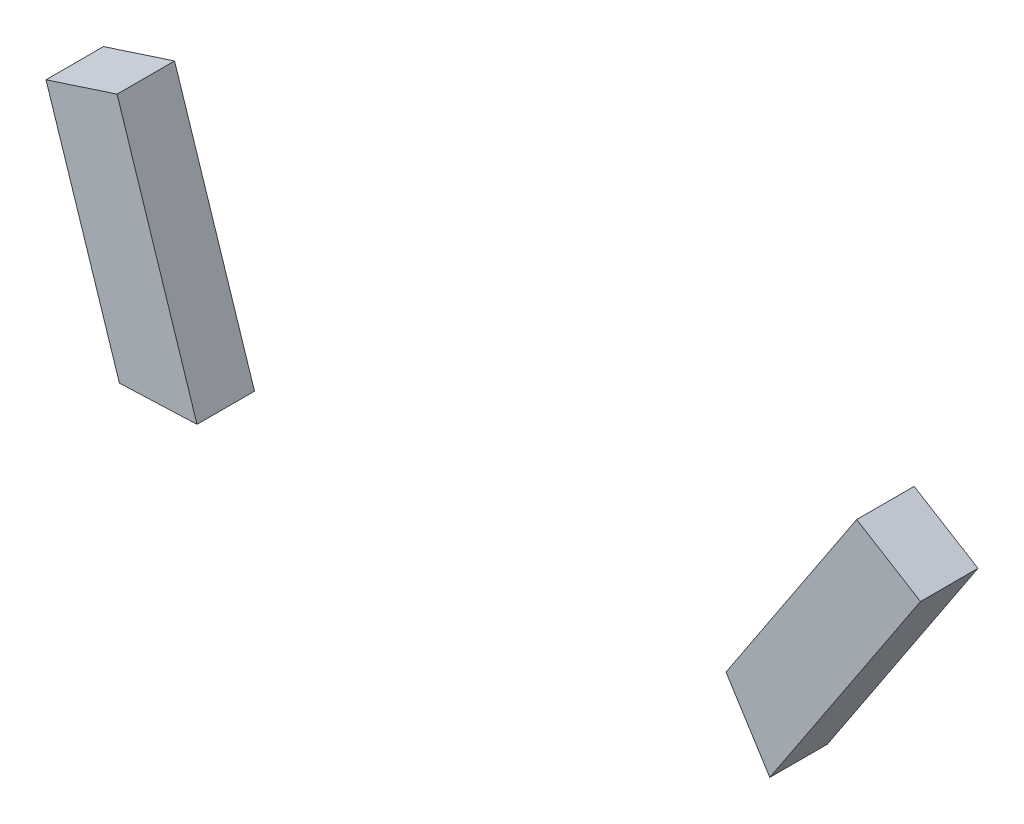
ISO-10303-21;
HEADER;
FILE_DESCRIPTION(('STEP AP214'),'2;1');
FILE_NAME('part.step','',(''),(''),'','','');
FILE_SCHEMA(('AUTOMOTIVE_DESIGN { 1 0 10303 214 1 1 1 1 }'));
ENDSEC;
DATA;
#1=APPLICATION_CONTEXT('core data for automotive mechanical design processes');
#2=APPLICATION_PROTOCOL_DEFINITION('international standard','automotive_design',2000,#1);
#3=PRODUCT_CONTEXT('',#1,'mechanical');
#4=PRODUCT('Part','Part','',(#3));
#5=PRODUCT_RELATED_PRODUCT_CATEGORY('part','',(#4));
#6=PRODUCT_DEFINITION_FORMATION('','',#4);
#7=PRODUCT_DEFINITION_CONTEXT('part definition',#1,'design');
#8=PRODUCT_DEFINITION('design','',#6,#7);
#9=PRODUCT_DEFINITION_SHAPE('','',#8);
#10=(LENGTH_UNIT() NAMED_UNIT(*) SI_UNIT(.MILLI.,.METRE.));
#11=(NAMED_UNIT(*) PLANE_ANGLE_UNIT() SI_UNIT($,.RADIAN.));
#12=(NAMED_UNIT(*) SI_UNIT($,.STERADIAN.) SOLID_ANGLE_UNIT());
#13=UNCERTAINTY_MEASURE_WITH_UNIT(LENGTH_MEASURE(1.E-05),#10,'distance_accuracy_value','');
#14=(GEOMETRIC_REPRESENTATION_CONTEXT(3) GLOBAL_UNCERTAINTY_ASSIGNED_CONTEXT((#13)) GLOBAL_UNIT_ASSIGNED_CONTEXT((#10,
#11,#12)) REPRESENTATION_CONTEXT('',''));
#15=CARTESIAN_POINT('',(0.,0.,0.));
#16=DIRECTION('',(0.,0.,1.));
#17=DIRECTION('',(1.,0.,0.));
#18=AXIS2_PLACEMENT_3D('',#15,#16,#17);
#19=CARTESIAN_POINT('',(-0.79770947286416,-0.259191519605136,0.4));
#20=DIRECTION('',(-0.951056516295153,-0.309016994374949,0.));
#21=DIRECTION('',(0.309016994374949,-0.951056516295153,0.));
#22=AXIS2_PLACEMENT_3D('',#19,#20,#21);
#23=PLANE('',#22);
#24=DIRECTION('',(-0.309016994374949,0.951056516295153,0.));
#25=VECTOR('',#24,1.);
#26=CARTESIAN_POINT('',(-0.79770947286416,-0.259191519605136,0.));
#27=LINE('',#26,#25);
#28=CARTESIAN_POINT('',(-2.01831531648811,3.49744699069618,0.));
#29=VERTEX_POINT('',#28);
#30=CARTESIAN_POINT('',(-2.52923756331339,5.06990397852694,0.));
#31=VERTEX_POINT('',#30);
#32=EDGE_CURVE('E105',#29,#31,#27,.T.);
#33=ORIENTED_EDGE('',*,*,#32,.F.);
#34=DIRECTION('',(0.,0.,-1.));
#35=VECTOR('',#34,1.);
#36=CARTESIAN_POINT('',(-2.01831531648811,3.49744699069618,0.4));
#37=LINE('',#36,#35);
#38=CARTESIAN_POINT('',(-2.01831531648811,3.49744699069618,0.4));
#39=VERTEX_POINT('',#38);
#40=EDGE_CURVE('E12',#39,#29,#37,.T.);
#41=ORIENTED_EDGE('',*,*,#40,.F.);
#42=DIRECTION('',(-0.309016994374949,0.951056516295153,0.));
#43=VECTOR('',#42,1.);
#44=CARTESIAN_POINT('',(-0.79770947286416,-0.259191519605136,0.4));
#45=LINE('',#44,#43);
#46=CARTESIAN_POINT('',(-2.52923756331339,5.06990397852694,0.4));
#47=VERTEX_POINT('',#46);
#48=EDGE_CURVE('E90',#39,#47,#45,.T.);
#49=ORIENTED_EDGE('',*,*,#48,.T.);
#50=DIRECTION('',(0.,0.,-1.));
#51=VECTOR('',#50,1.);
#52=CARTESIAN_POINT('',(-2.52923756331339,5.06990397852694,0.4));
#53=LINE('',#52,#51);
#54=EDGE_CURVE('E58',#47,#31,#53,.T.);
#55=ORIENTED_EDGE('',*,*,#54,.T.);
#56=EDGE_LOOP('',(#33,#41,#49,#55));
#57=FACE_BOUND('',#56,.T.);
#58=ADVANCED_FACE('F42',(#57),#23,.T.);
#59=CARTESIAN_POINT('',(-0.140536818504142,3.57133998796101,0.4));
#60=DIRECTION('',(-0.0393208523677325,0.999226636238784,0.));
#61=DIRECTION('',(-0.999226636238784,-0.0393208523677325,0.));
#62=AXIS2_PLACEMENT_3D('',#59,#60,#61);
#63=PLANE('',#62);
#64=DIRECTION('',(0.999226636238784,0.0393208523677325,0.));
#65=VECTOR('',#64,1.);
#66=CARTESIAN_POINT('',(-0.140536818504142,3.57133998796101,0.));
#67=LINE('',#66,#65);
#68=CARTESIAN_POINT('',(-1.478457584965,3.51869108627064,0.));
#69=VERTEX_POINT('',#68);
#70=EDGE_CURVE('E96',#29,#69,#67,.T.);
#71=ORIENTED_EDGE('',*,*,#70,.T.);
#72=DIRECTION('',(0.,0.,-1.));
#73=VECTOR('',#72,1.);
#74=CARTESIAN_POINT('',(-1.478457584965,3.51869108627064,0.4));
#75=LINE('',#74,#73);
#76=CARTESIAN_POINT('',(-1.478457584965,3.51869108627064,0.4));
#77=VERTEX_POINT('',#76);
#78=EDGE_CURVE('E50',#77,#69,#75,.T.);
#79=ORIENTED_EDGE('',*,*,#78,.F.);
#80=DIRECTION('',(0.999226636238784,0.0393208523677325,0.));
#81=VECTOR('',#80,1.);
#82=CARTESIAN_POINT('',(-0.140536818504142,3.57133998796101,0.4));
#83=LINE('',#82,#81);
#84=EDGE_CURVE('E84',#39,#77,#83,.T.);
#85=ORIENTED_EDGE('',*,*,#84,.F.);
#86=ORIENTED_EDGE('',*,*,#40,.T.);
#87=EDGE_LOOP('',(#71,#79,#85,#86));
#88=FACE_BOUND('',#87,.T.);
#89=ADVANCED_FACE('F94',(#88),#63,.F.);
#90=CARTESIAN_POINT('',(-0.303160084390678,-0.098502682530162,0.4));
#91=DIRECTION('',(0.951056516295153,0.309016994374949,0.));
#92=DIRECTION('',(-0.309016994374949,0.951056516295153,0.));
#93=AXIS2_PLACEMENT_3D('',#90,#91,#92);
#94=PLANE('',#93);
#95=DIRECTION('',(0.309016994374949,-0.951056516295153,0.));
#96=VECTOR('',#95,1.);
#97=CARTESIAN_POINT('',(-0.303160084390678,-0.098502682530162,0.));
#98=LINE('',#97,#96);
#99=CARTESIAN_POINT('',(-2.03468817483991,5.23059281560192,0.));
#100=VERTEX_POINT('',#99);
#101=EDGE_CURVE('E108',#100,#69,#98,.T.);
#102=ORIENTED_EDGE('',*,*,#101,.F.);
#103=DIRECTION('',(0.,0.,-1.));
#104=VECTOR('',#103,1.);
#105=CARTESIAN_POINT('',(-2.03468817483991,5.23059281560192,0.4));
#106=LINE('',#105,#104);
#107=CARTESIAN_POINT('',(-2.03468817483991,5.23059281560192,0.4));
#108=VERTEX_POINT('',#107);
#109=EDGE_CURVE('E71',#108,#100,#106,.T.);
#110=ORIENTED_EDGE('',*,*,#109,.F.);
#111=DIRECTION('',(0.309016994374949,-0.951056516295153,0.));
#112=VECTOR('',#111,1.);
#113=CARTESIAN_POINT('',(-0.303160084390678,-0.098502682530162,0.4));
#114=LINE('',#113,#112);
#115=EDGE_CURVE('E89',#108,#77,#114,.T.);
#116=ORIENTED_EDGE('',*,*,#115,.T.);
#117=ORIENTED_EDGE('',*,*,#78,.T.);
#118=EDGE_LOOP('',(#102,#110,#116,#117));
#119=FACE_BOUND('',#118,.T.);
#120=ADVANCED_FACE('F99',(#119),#94,.T.);
#121=CARTESIAN_POINT('',(-1.73152809044923,5.32909549813208,0.4));
#122=DIRECTION('',(-0.309016994374948,0.951056516295154,0.));
#123=DIRECTION('',(-0.951056516295154,-0.309016994374948,0.));
#124=AXIS2_PLACEMENT_3D('',#121,#122,#123);
#125=PLANE('',#124);
#126=DIRECTION('',(0.951056516295153,0.309016994374948,0.));
#127=VECTOR('',#126,1.);
#128=CARTESIAN_POINT('',(-1.73152809044923,5.32909549813208,0.));
#129=LINE('',#128,#127);
#130=EDGE_CURVE('E110',#31,#100,#129,.T.);
#131=ORIENTED_EDGE('',*,*,#130,.F.);
#132=ORIENTED_EDGE('',*,*,#54,.F.);
#133=DIRECTION('',(0.951056516295153,0.309016994374948,0.));
#134=VECTOR('',#133,1.);
#135=CARTESIAN_POINT('',(-1.73152809044923,5.32909549813208,0.4));
#136=LINE('',#135,#134);
#137=EDGE_CURVE('E100',#47,#108,#136,.T.);
#138=ORIENTED_EDGE('',*,*,#137,.T.);
#139=ORIENTED_EDGE('',*,*,#109,.T.);
#140=EDGE_LOOP('',(#131,#132,#138,#139));
#141=FACE_BOUND('',#140,.T.);
#142=ADVANCED_FACE('F115',(#141),#125,.T.);
#143=CARTESIAN_POINT('',(0.,0.,0.4));
#144=DIRECTION('',(0.,0.,1.));
#145=DIRECTION('',(1.,0.,0.));
#146=AXIS2_PLACEMENT_3D('',#143,#144,#145);
#147=PLANE('',#146);
#148=ORIENTED_EDGE('',*,*,#48,.F.);
#149=ORIENTED_EDGE('',*,*,#84,.T.);
#150=ORIENTED_EDGE('',*,*,#115,.F.);
#151=ORIENTED_EDGE('',*,*,#137,.F.);
#152=EDGE_LOOP('',(#148,#149,#150,#151));
#153=FACE_BOUND('',#152,.T.);
#154=ADVANCED_FACE('F86',(#153),#147,.T.);
#155=CARTESIAN_POINT('',(0.,0.,0.));
#156=DIRECTION('',(0.,0.,1.));
#157=DIRECTION('',(1.,0.,0.));
#158=AXIS2_PLACEMENT_3D('',#155,#156,#157);
#159=PLANE('',#158);
#160=ORIENTED_EDGE('',*,*,#32,.T.);
#161=ORIENTED_EDGE('',*,*,#130,.T.);
#162=ORIENTED_EDGE('',*,*,#101,.T.);
#163=ORIENTED_EDGE('',*,*,#70,.F.);
#164=EDGE_LOOP('',(#160,#161,#162,#163));
#165=FACE_BOUND('',#164,.T.);
#166=ADVANCED_FACE('F122',(#165),#159,.F.);
#167=CLOSED_SHELL('',(#58,#89,#120,#142,#154,#166));
#168=MANIFOLD_SOLID_BREP('B2',#167);
#169=CARTESIAN_POINT('',(0.185847367287524,-0.123009688993845,0.4));
#170=DIRECTION('',(-0.833885822067168,0.551936985312059,0.));
#171=DIRECTION('',(-0.551936985312059,-0.833885822067168,0.));
#172=AXIS2_PLACEMENT_3D('',#169,#170,#171);
#173=PLANE('',#172);
#174=DIRECTION('',(0.551936985312059,0.833885822067168,0.));
#175=VECTOR('',#174,1.);
#176=CARTESIAN_POINT('',(0.185847367287524,-0.123009688993845,0.));
#177=LINE('',#176,#175);
#178=CARTESIAN_POINT('',(2.50706064303793,3.383961019896,0.));
#179=VERTEX_POINT('',#178);
#180=CARTESIAN_POINT('',(3.55574091513085,4.96834408182363,0.));
#181=VERTEX_POINT('',#180);
#182=EDGE_CURVE('E240',#179,#181,#177,.T.);
#183=ORIENTED_EDGE('',*,*,#182,.T.);
#184=DIRECTION('',(0.,0.,-1.));
#185=VECTOR('',#184,1.);
#186=CARTESIAN_POINT('',(3.55574091513085,4.96834408182363,0.4));
#187=LINE('',#186,#185);
#188=CARTESIAN_POINT('',(3.55574091513085,4.96834408182363,0.4));
#189=VERTEX_POINT('',#188);
#190=EDGE_CURVE('E40',#189,#181,#187,.T.);
#191=ORIENTED_EDGE('',*,*,#190,.F.);
#192=DIRECTION('',(0.551936985312059,0.833885822067168,0.));
#193=VECTOR('',#192,1.);
#194=CARTESIAN_POINT('',(0.185847367287524,-0.123009688993845,0.4));
#195=LINE('',#194,#193);
#196=CARTESIAN_POINT('',(2.50706064303793,3.383961019896,0.4));
#197=VERTEX_POINT('',#196);
#198=EDGE_CURVE('E226',#197,#189,#195,.T.);
#199=ORIENTED_EDGE('',*,*,#198,.F.);
#200=DIRECTION('',(0.,0.,-1.));
#201=VECTOR('',#200,1.);
#202=CARTESIAN_POINT('',(2.50706064303793,3.383961019896,0.4));
#203=LINE('',#202,#201);
#204=EDGE_CURVE('E193',#197,#179,#203,.T.);
#205=ORIENTED_EDGE('',*,*,#204,.T.);
#206=EDGE_LOOP('',(#183,#191,#199,#205));
#207=FACE_BOUND('',#206,.T.);
#208=ADVANCED_FACE('F177',(#207),#173,.F.);
#209=CARTESIAN_POINT('',(3.18093450142574,5.19772052611679,0.4));
#210=DIRECTION('',(-0.521993506228005,-0.852949458910547,0.));
#211=DIRECTION('',(0.852949458910547,-0.521993506228005,0.));
#212=AXIS2_PLACEMENT_3D('',#209,#210,#211);
#213=PLANE('',#212);
#214=DIRECTION('',(-0.852949458910547,0.521993506228005,0.));
#215=VECTOR('',#214,1.);
#216=CARTESIAN_POINT('',(3.18093450142574,5.19772052611679,0.));
#217=LINE('',#216,#215);
#218=CARTESIAN_POINT('',(3.11151747661765,5.2402028042787,0.));
#219=VERTEX_POINT('',#218);
#220=EDGE_CURVE('E231',#181,#219,#217,.T.);
#221=ORIENTED_EDGE('',*,*,#220,.T.);
#222=DIRECTION('',(0.,0.,-1.));
#223=VECTOR('',#222,1.);
#224=CARTESIAN_POINT('',(3.11151747661765,5.2402028042787,0.4));
#225=LINE('',#224,#223);
#226=CARTESIAN_POINT('',(3.11151747661765,5.2402028042787,0.4));
#227=VERTEX_POINT('',#226);
#228=EDGE_CURVE('E185',#227,#219,#225,.T.);
#229=ORIENTED_EDGE('',*,*,#228,.F.);
#230=DIRECTION('',(-0.852949458910547,0.521993506228005,0.));
#231=VECTOR('',#230,1.);
#232=CARTESIAN_POINT('',(3.18093450142574,5.19772052611679,0.4));
#233=LINE('',#232,#231);
#234=EDGE_CURVE('E218',#189,#227,#233,.T.);
#235=ORIENTED_EDGE('',*,*,#234,.F.);
#236=ORIENTED_EDGE('',*,*,#190,.T.);
#237=EDGE_LOOP('',(#221,#229,#235,#236));
#238=FACE_BOUND('',#237,.T.);
#239=ADVANCED_FACE('F230',(#238),#213,.F.);
#240=CARTESIAN_POINT('',(-0.248173951421536,0.164262755110796,0.4));
#241=DIRECTION('',(-0.833885822067168,0.551936985312058,0.));
#242=DIRECTION('',(-0.551936985312058,-0.833885822067168,0.));
#243=AXIS2_PLACEMENT_3D('',#240,#241,#242);
#244=PLANE('',#243);
#245=DIRECTION('',(0.551936985312058,0.833885822067168,0.));
#246=VECTOR('',#245,1.);
#247=CARTESIAN_POINT('',(-0.248173951421536,0.164262755110796,0.));
#248=LINE('',#247,#246);
#249=CARTESIAN_POINT('',(2.20242501666598,3.86671392153378,0.));
#250=VERTEX_POINT('',#249);
#251=EDGE_CURVE('E243',#250,#219,#248,.T.);
#252=ORIENTED_EDGE('',*,*,#251,.F.);
#253=DIRECTION('',(0.,0.,-1.));
#254=VECTOR('',#253,1.);
#255=CARTESIAN_POINT('',(2.20242501666598,3.86671392153378,0.4));
#256=LINE('',#255,#254);
#257=CARTESIAN_POINT('',(2.20242501666598,3.86671392153378,0.4));
#258=VERTEX_POINT('',#257);
#259=EDGE_CURVE('E207',#258,#250,#256,.T.);
#260=ORIENTED_EDGE('',*,*,#259,.F.);
#261=DIRECTION('',(0.551936985312058,0.833885822067168,0.));
#262=VECTOR('',#261,1.);
#263=CARTESIAN_POINT('',(-0.248173951421536,0.164262755110796,0.4));
#264=LINE('',#263,#262);
#265=EDGE_CURVE('E225',#258,#227,#264,.T.);
#266=ORIENTED_EDGE('',*,*,#265,.T.);
#267=ORIENTED_EDGE('',*,*,#228,.T.);
#268=EDGE_LOOP('',(#252,#260,#266,#267));
#269=FACE_BOUND('',#268,.T.);
#270=ADVANCED_FACE('F234',(#269),#244,.T.);
#271=CARTESIAN_POINT('',(3.32029649565813,2.09523464129138,0.4));
#272=DIRECTION('',(-0.84569522493698,-0.533666175168326,0.));
#273=DIRECTION('',(0.533666175168326,-0.84569522493698,0.));
#274=AXIS2_PLACEMENT_3D('',#271,#272,#273);
#275=PLANE('',#274);
#276=DIRECTION('',(-0.533666175168326,0.84569522493698,0.));
#277=VECTOR('',#276,1.);
#278=CARTESIAN_POINT('',(3.32029649565813,2.09523464129138,0.));
#279=LINE('',#278,#277);
#280=EDGE_CURVE('E245',#179,#250,#279,.T.);
#281=ORIENTED_EDGE('',*,*,#280,.F.);
#282=ORIENTED_EDGE('',*,*,#204,.F.);
#283=DIRECTION('',(-0.533666175168326,0.84569522493698,0.));
#284=VECTOR('',#283,1.);
#285=CARTESIAN_POINT('',(3.32029649565813,2.09523464129138,0.4));
#286=LINE('',#285,#284);
#287=EDGE_CURVE('E235',#197,#258,#286,.T.);
#288=ORIENTED_EDGE('',*,*,#287,.T.);
#289=ORIENTED_EDGE('',*,*,#259,.T.);
#290=EDGE_LOOP('',(#281,#282,#288,#289));
#291=FACE_BOUND('',#290,.T.);
#292=ADVANCED_FACE('F251',(#291),#275,.T.);
#293=CARTESIAN_POINT('',(0.,0.,0.4));
#294=DIRECTION('',(0.,0.,1.));
#295=DIRECTION('',(1.,0.,0.));
#296=AXIS2_PLACEMENT_3D('',#293,#294,#295);
#297=PLANE('',#296);
#298=ORIENTED_EDGE('',*,*,#198,.T.);
#299=ORIENTED_EDGE('',*,*,#234,.T.);
#300=ORIENTED_EDGE('',*,*,#265,.F.);
#301=ORIENTED_EDGE('',*,*,#287,.F.);
#302=EDGE_LOOP('',(#298,#299,#300,#301));
#303=FACE_BOUND('',#302,.T.);
#304=ADVANCED_FACE('F222',(#303),#297,.T.);
#305=CARTESIAN_POINT('',(0.,0.,0.));
#306=DIRECTION('',(0.,0.,1.));
#307=DIRECTION('',(1.,0.,0.));
#308=AXIS2_PLACEMENT_3D('',#305,#306,#307);
#309=PLANE('',#308);
#310=ORIENTED_EDGE('',*,*,#182,.F.);
#311=ORIENTED_EDGE('',*,*,#280,.T.);
#312=ORIENTED_EDGE('',*,*,#251,.T.);
#313=ORIENTED_EDGE('',*,*,#220,.F.);
#314=EDGE_LOOP('',(#310,#311,#312,#313));
#315=FACE_BOUND('',#314,.T.);
#316=ADVANCED_FACE('F250',(#315),#309,.F.);
#317=CLOSED_SHELL('',(#208,#239,#270,#292,#304,#316));
#318=MANIFOLD_SOLID_BREP('B6',#317);
#319=ADVANCED_BREP_SHAPE_REPRESENTATION('',(#18,#168,#318),#14);
#320=SHAPE_DEFINITION_REPRESENTATION(#9,#319);
ENDSEC;
END-ISO-10303-21;
